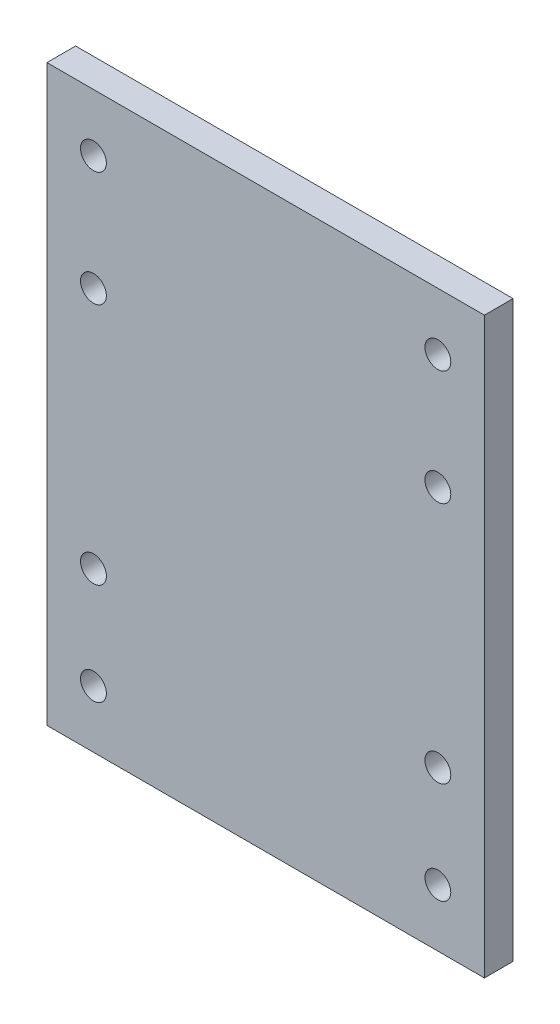
ISO-10303-21;
HEADER;
FILE_DESCRIPTION(('STEP AP214'),'2;1');
FILE_NAME('part.step','',(''),(''),'','','');
FILE_SCHEMA(('AUTOMOTIVE_DESIGN { 1 0 10303 214 1 1 1 1 }'));
ENDSEC;
DATA;
#1=APPLICATION_CONTEXT('core data for automotive mechanical design processes');
#2=APPLICATION_PROTOCOL_DEFINITION('international standard','automotive_design',2000,#1);
#3=PRODUCT_CONTEXT('',#1,'mechanical');
#4=PRODUCT('Part','Part','',(#3));
#5=PRODUCT_RELATED_PRODUCT_CATEGORY('part','',(#4));
#6=PRODUCT_DEFINITION_FORMATION('','',#4);
#7=PRODUCT_DEFINITION_CONTEXT('part definition',#1,'design');
#8=PRODUCT_DEFINITION('design','',#6,#7);
#9=PRODUCT_DEFINITION_SHAPE('','',#8);
#10=(LENGTH_UNIT() NAMED_UNIT(*) SI_UNIT(.MILLI.,.METRE.));
#11=(NAMED_UNIT(*) PLANE_ANGLE_UNIT() SI_UNIT($,.RADIAN.));
#12=(NAMED_UNIT(*) SI_UNIT($,.STERADIAN.) SOLID_ANGLE_UNIT());
#13=UNCERTAINTY_MEASURE_WITH_UNIT(LENGTH_MEASURE(1.E-05),#10,'distance_accuracy_value','');
#14=(GEOMETRIC_REPRESENTATION_CONTEXT(3) GLOBAL_UNCERTAINTY_ASSIGNED_CONTEXT((#13)) GLOBAL_UNIT_ASSIGNED_CONTEXT((#10,
#11,#12)) REPRESENTATION_CONTEXT('',''));
#15=CARTESIAN_POINT('',(0.,0.,0.));
#16=DIRECTION('',(0.,0.,1.));
#17=DIRECTION('',(1.,0.,0.));
#18=AXIS2_PLACEMENT_3D('',#15,#16,#17);
#19=CARTESIAN_POINT('',(-35.7444039436923,37.4815224030728,5.));
#20=DIRECTION('',(1.,0.,0.));
#21=DIRECTION('',(0.,1.,0.));
#22=AXIS2_PLACEMENT_3D('',#19,#20,#21);
#23=PLANE('',#22);
#24=DIRECTION('',(0.,-1.,0.));
#25=VECTOR('',#24,1.);
#26=CARTESIAN_POINT('',(-35.7444039436923,37.4815224030728,0.));
#27=LINE('',#26,#25);
#28=CARTESIAN_POINT('',(-35.7444039436923,37.4815224030728,0.));
#29=VERTEX_POINT('',#28);
#30=CARTESIAN_POINT('',(-35.7444039436923,-62.5184775969272,0.));
#31=VERTEX_POINT('',#30);
#32=EDGE_CURVE('E107',#29,#31,#27,.T.);
#33=ORIENTED_EDGE('',*,*,#32,.T.);
#34=DIRECTION('',(0.,0.,-1.));
#35=VECTOR('',#34,1.);
#36=CARTESIAN_POINT('',(-35.7444039436923,-62.5184775969272,5.));
#37=LINE('',#36,#35);
#38=CARTESIAN_POINT('',(-35.7444039436923,-62.5184775969272,5.));
#39=VERTEX_POINT('',#38);
#40=EDGE_CURVE('E11',#39,#31,#37,.T.);
#41=ORIENTED_EDGE('',*,*,#40,.F.);
#42=DIRECTION('',(0.,-1.,0.));
#43=VECTOR('',#42,1.);
#44=CARTESIAN_POINT('',(-35.7444039436923,37.4815224030728,5.));
#45=LINE('',#44,#43);
#46=CARTESIAN_POINT('',(-35.7444039436923,37.4815224030728,5.));
#47=VERTEX_POINT('',#46);
#48=EDGE_CURVE('E91',#47,#39,#45,.T.);
#49=ORIENTED_EDGE('',*,*,#48,.F.);
#50=DIRECTION('',(0.,0.,-1.));
#51=VECTOR('',#50,1.);
#52=CARTESIAN_POINT('',(-35.7444039436923,37.4815224030728,5.));
#53=LINE('',#52,#51);
#54=EDGE_CURVE('E103',#47,#29,#53,.T.);
#55=ORIENTED_EDGE('',*,*,#54,.T.);
#56=EDGE_LOOP('',(#33,#41,#49,#55));
#57=FACE_BOUND('',#56,.T.);
#58=ADVANCED_FACE('F39',(#57),#23,.F.);
#59=CARTESIAN_POINT('',(-35.7444039436923,-62.5184775969272,5.));
#60=DIRECTION('',(0.,1.,0.));
#61=DIRECTION('',(0.,0.,1.));
#62=AXIS2_PLACEMENT_3D('',#59,#60,#61);
#63=PLANE('',#62);
#64=DIRECTION('',(1.,0.,0.));
#65=VECTOR('',#64,1.);
#66=CARTESIAN_POINT('',(-35.7444039436923,-62.5184775969272,0.));
#67=LINE('',#66,#65);
#68=CARTESIAN_POINT('',(40.4655960563078,-62.5184775969272,0.));
#69=VERTEX_POINT('',#68);
#70=EDGE_CURVE('E96',#31,#69,#67,.T.);
#71=ORIENTED_EDGE('',*,*,#70,.T.);
#72=DIRECTION('',(0.,0.,-1.));
#73=VECTOR('',#72,1.);
#74=CARTESIAN_POINT('',(40.4655960563078,-62.5184775969272,5.));
#75=LINE('',#74,#73);
#76=CARTESIAN_POINT('',(40.4655960563078,-62.5184775969272,5.));
#77=VERTEX_POINT('',#76);
#78=EDGE_CURVE('E48',#77,#69,#75,.T.);
#79=ORIENTED_EDGE('',*,*,#78,.F.);
#80=DIRECTION('',(1.,0.,0.));
#81=VECTOR('',#80,1.);
#82=CARTESIAN_POINT('',(-35.7444039436923,-62.5184775969272,5.));
#83=LINE('',#82,#81);
#84=EDGE_CURVE('E86',#39,#77,#83,.T.);
#85=ORIENTED_EDGE('',*,*,#84,.F.);
#86=ORIENTED_EDGE('',*,*,#40,.T.);
#87=EDGE_LOOP('',(#71,#79,#85,#86));
#88=FACE_BOUND('',#87,.T.);
#89=ADVANCED_FACE('F95',(#88),#63,.F.);
#90=CARTESIAN_POINT('',(40.4655960563077,37.4815224030728,5.));
#91=DIRECTION('',(-1.,0.,0.));
#92=DIRECTION('',(0.,-1.,0.));
#93=AXIS2_PLACEMENT_3D('',#90,#91,#92);
#94=PLANE('',#93);
#95=DIRECTION('',(0.,1.,0.));
#96=VECTOR('',#95,1.);
#97=CARTESIAN_POINT('',(40.4655960563077,37.4815224030728,0.));
#98=LINE('',#97,#96);
#99=CARTESIAN_POINT('',(40.4655960563077,37.4815224030728,0.));
#100=VERTEX_POINT('',#99);
#101=EDGE_CURVE('E73',#69,#100,#98,.T.);
#102=ORIENTED_EDGE('',*,*,#101,.T.);
#103=DIRECTION('',(0.,0.,-1.));
#104=VECTOR('',#103,1.);
#105=CARTESIAN_POINT('',(40.4655960563077,37.4815224030728,5.));
#106=LINE('',#105,#104);
#107=CARTESIAN_POINT('',(40.4655960563077,37.4815224030728,5.));
#108=VERTEX_POINT('',#107);
#109=EDGE_CURVE('E98',#108,#100,#106,.T.);
#110=ORIENTED_EDGE('',*,*,#109,.F.);
#111=DIRECTION('',(0.,1.,0.));
#112=VECTOR('',#111,1.);
#113=CARTESIAN_POINT('',(40.4655960563077,37.4815224030728,5.));
#114=LINE('',#113,#112);
#115=EDGE_CURVE('E89',#77,#108,#114,.T.);
#116=ORIENTED_EDGE('',*,*,#115,.F.);
#117=ORIENTED_EDGE('',*,*,#78,.T.);
#118=EDGE_LOOP('',(#102,#110,#116,#117));
#119=FACE_BOUND('',#118,.T.);
#120=ADVANCED_FACE('F99',(#119),#94,.F.);
#121=CARTESIAN_POINT('',(-35.7444039436923,37.4815224030728,5.));
#122=DIRECTION('',(0.,-1.,0.));
#123=DIRECTION('',(0.,0.,-1.));
#124=AXIS2_PLACEMENT_3D('',#121,#122,#123);
#125=PLANE('',#124);
#126=DIRECTION('',(-1.,0.,0.));
#127=VECTOR('',#126,1.);
#128=CARTESIAN_POINT('',(-35.7444039436923,37.4815224030728,0.));
#129=LINE('',#128,#127);
#130=EDGE_CURVE('E79',#100,#29,#129,.T.);
#131=ORIENTED_EDGE('',*,*,#130,.T.);
#132=ORIENTED_EDGE('',*,*,#54,.F.);
#133=DIRECTION('',(-1.,0.,0.));
#134=VECTOR('',#133,1.);
#135=CARTESIAN_POINT('',(-35.7444039436923,37.4815224030728,5.));
#136=LINE('',#135,#134);
#137=EDGE_CURVE('E56',#108,#47,#136,.T.);
#138=ORIENTED_EDGE('',*,*,#137,.F.);
#139=ORIENTED_EDGE('',*,*,#109,.T.);
#140=EDGE_LOOP('',(#131,#132,#138,#139));
#141=FACE_BOUND('',#140,.T.);
#142=ADVANCED_FACE('F121',(#141),#125,.F.);
#143=CARTESIAN_POINT('',(0.,0.,5.));
#144=DIRECTION('',(0.,0.,1.));
#145=DIRECTION('',(1.,0.,0.));
#146=AXIS2_PLACEMENT_3D('',#143,#144,#145);
#147=PLANE('',#146);
#148=CARTESIAN_POINT('',(-27.6394039436923,7.48152240307282,5.));
#149=DIRECTION('',(0.,0.,1.));
#150=DIRECTION('',(1.,0.,0.));
#151=AXIS2_PLACEMENT_3D('',#148,#149,#150);
#152=CIRCLE('',#151,2.25);
#153=CARTESIAN_POINT('',(-25.3894039436923,7.48152240307282,5.));
#154=VERTEX_POINT('',#153);
#155=EDGE_CURVE('E187',#154,#154,#152,.T.);
#156=ORIENTED_EDGE('',*,*,#155,.F.);
#157=EDGE_LOOP('',(#156));
#158=FACE_BOUND('',#157,.T.);
#159=CARTESIAN_POINT('',(-27.6394039436923,27.4815224030728,5.));
#160=DIRECTION('',(0.,0.,1.));
#161=DIRECTION('',(1.,0.,0.));
#162=AXIS2_PLACEMENT_3D('',#159,#160,#161);
#163=CIRCLE('',#162,2.25);
#164=CARTESIAN_POINT('',(-25.3894039436923,27.4815224030728,5.));
#165=VERTEX_POINT('',#164);
#166=EDGE_CURVE('E179',#165,#165,#163,.T.);
#167=ORIENTED_EDGE('',*,*,#166,.F.);
#168=EDGE_LOOP('',(#167));
#169=FACE_BOUND('',#168,.T.);
#170=CARTESIAN_POINT('',(32.3605960563077,7.48152240307282,5.));
#171=DIRECTION('',(0.,0.,1.));
#172=DIRECTION('',(1.,0.,0.));
#173=AXIS2_PLACEMENT_3D('',#170,#171,#172);
#174=CIRCLE('',#173,2.25);
#175=CARTESIAN_POINT('',(34.6105960563077,7.48152240307282,5.));
#176=VERTEX_POINT('',#175);
#177=EDGE_CURVE('E171',#176,#176,#174,.T.);
#178=ORIENTED_EDGE('',*,*,#177,.F.);
#179=EDGE_LOOP('',(#178));
#180=FACE_BOUND('',#179,.T.);
#181=CARTESIAN_POINT('',(32.3605960563077,27.4815224030728,5.));
#182=DIRECTION('',(0.,0.,1.));
#183=DIRECTION('',(1.,0.,0.));
#184=AXIS2_PLACEMENT_3D('',#181,#182,#183);
#185=CIRCLE('',#184,2.25);
#186=CARTESIAN_POINT('',(34.6105960563077,27.4815224030728,5.));
#187=VERTEX_POINT('',#186);
#188=EDGE_CURVE('E163',#187,#187,#185,.T.);
#189=ORIENTED_EDGE('',*,*,#188,.F.);
#190=EDGE_LOOP('',(#189));
#191=FACE_BOUND('',#190,.T.);
#192=CARTESIAN_POINT('',(32.3605960563077,-52.5184775969272,5.));
#193=DIRECTION('',(0.,0.,1.));
#194=DIRECTION('',(1.,0.,0.));
#195=AXIS2_PLACEMENT_3D('',#192,#193,#194);
#196=CIRCLE('',#195,2.25);
#197=CARTESIAN_POINT('',(34.6105960563077,-52.5184775969272,5.));
#198=VERTEX_POINT('',#197);
#199=EDGE_CURVE('E155',#198,#198,#196,.T.);
#200=ORIENTED_EDGE('',*,*,#199,.F.);
#201=EDGE_LOOP('',(#200));
#202=FACE_BOUND('',#201,.T.);
#203=CARTESIAN_POINT('',(32.3605960563077,-34.818262244962,5.));
#204=DIRECTION('',(0.,0.,1.));
#205=DIRECTION('',(1.,0.,0.));
#206=AXIS2_PLACEMENT_3D('',#203,#204,#205);
#207=CIRCLE('',#206,2.25);
#208=CARTESIAN_POINT('',(34.6105960563077,-34.818262244962,5.));
#209=VERTEX_POINT('',#208);
#210=EDGE_CURVE('E147',#209,#209,#207,.T.);
#211=ORIENTED_EDGE('',*,*,#210,.F.);
#212=EDGE_LOOP('',(#211));
#213=FACE_BOUND('',#212,.T.);
#214=CARTESIAN_POINT('',(-27.6394039436923,-34.818262244962,5.));
#215=DIRECTION('',(0.,0.,1.));
#216=DIRECTION('',(1.,0.,0.));
#217=AXIS2_PLACEMENT_3D('',#214,#215,#216);
#218=CIRCLE('',#217,2.25);
#219=CARTESIAN_POINT('',(-25.3894039436923,-34.818262244962,5.));
#220=VERTEX_POINT('',#219);
#221=EDGE_CURVE('E139',#220,#220,#218,.T.);
#222=ORIENTED_EDGE('',*,*,#221,.F.);
#223=EDGE_LOOP('',(#222));
#224=FACE_BOUND('',#223,.T.);
#225=CARTESIAN_POINT('',(-27.6394039436923,-52.5184775969272,5.));
#226=DIRECTION('',(0.,0.,1.));
#227=DIRECTION('',(1.,0.,0.));
#228=AXIS2_PLACEMENT_3D('',#225,#226,#227);
#229=CIRCLE('',#228,2.25);
#230=CARTESIAN_POINT('',(-25.3894039436923,-52.5184775969272,5.));
#231=VERTEX_POINT('',#230);
#232=EDGE_CURVE('E131',#231,#231,#229,.T.);
#233=ORIENTED_EDGE('',*,*,#232,.F.);
#234=EDGE_LOOP('',(#233));
#235=FACE_BOUND('',#234,.T.);
#236=ORIENTED_EDGE('',*,*,#48,.T.);
#237=ORIENTED_EDGE('',*,*,#84,.T.);
#238=ORIENTED_EDGE('',*,*,#115,.T.);
#239=ORIENTED_EDGE('',*,*,#137,.T.);
#240=EDGE_LOOP('',(#236,#237,#238,#239));
#241=FACE_BOUND('',#240,.T.);
#242=ADVANCED_FACE('F87',(#158,#169,#180,#191,#202,#213,#224,#235,#241),#147,.T.);
#243=CARTESIAN_POINT('',(0.,0.,0.));
#244=DIRECTION('',(0.,0.,1.));
#245=DIRECTION('',(1.,0.,0.));
#246=AXIS2_PLACEMENT_3D('',#243,#244,#245);
#247=PLANE('',#246);
#248=CARTESIAN_POINT('',(-27.6394039436923,7.48152240307282,0.));
#249=DIRECTION('',(0.,0.,1.));
#250=DIRECTION('',(1.,0.,0.));
#251=AXIS2_PLACEMENT_3D('',#248,#249,#250);
#252=CIRCLE('',#251,2.25);
#253=CARTESIAN_POINT('',(-25.3894039436923,7.48152240307282,0.));
#254=VERTEX_POINT('',#253);
#255=EDGE_CURVE('E183',#254,#254,#252,.T.);
#256=ORIENTED_EDGE('',*,*,#255,.T.);
#257=EDGE_LOOP('',(#256));
#258=FACE_BOUND('',#257,.T.);
#259=CARTESIAN_POINT('',(-27.6394039436923,27.4815224030728,0.));
#260=DIRECTION('',(0.,0.,1.));
#261=DIRECTION('',(1.,0.,0.));
#262=AXIS2_PLACEMENT_3D('',#259,#260,#261);
#263=CIRCLE('',#262,2.25);
#264=CARTESIAN_POINT('',(-25.3894039436923,27.4815224030728,0.));
#265=VERTEX_POINT('',#264);
#266=EDGE_CURVE('E175',#265,#265,#263,.T.);
#267=ORIENTED_EDGE('',*,*,#266,.T.);
#268=EDGE_LOOP('',(#267));
#269=FACE_BOUND('',#268,.T.);
#270=CARTESIAN_POINT('',(32.3605960563077,7.48152240307282,0.));
#271=DIRECTION('',(0.,0.,1.));
#272=DIRECTION('',(1.,0.,0.));
#273=AXIS2_PLACEMENT_3D('',#270,#271,#272);
#274=CIRCLE('',#273,2.25);
#275=CARTESIAN_POINT('',(34.6105960563077,7.48152240307282,0.));
#276=VERTEX_POINT('',#275);
#277=EDGE_CURVE('E167',#276,#276,#274,.T.);
#278=ORIENTED_EDGE('',*,*,#277,.T.);
#279=EDGE_LOOP('',(#278));
#280=FACE_BOUND('',#279,.T.);
#281=CARTESIAN_POINT('',(32.3605960563077,27.4815224030728,0.));
#282=DIRECTION('',(0.,0.,1.));
#283=DIRECTION('',(1.,0.,0.));
#284=AXIS2_PLACEMENT_3D('',#281,#282,#283);
#285=CIRCLE('',#284,2.25);
#286=CARTESIAN_POINT('',(34.6105960563077,27.4815224030728,0.));
#287=VERTEX_POINT('',#286);
#288=EDGE_CURVE('E159',#287,#287,#285,.T.);
#289=ORIENTED_EDGE('',*,*,#288,.T.);
#290=EDGE_LOOP('',(#289));
#291=FACE_BOUND('',#290,.T.);
#292=CARTESIAN_POINT('',(32.3605960563077,-52.5184775969272,0.));
#293=DIRECTION('',(0.,0.,1.));
#294=DIRECTION('',(1.,0.,0.));
#295=AXIS2_PLACEMENT_3D('',#292,#293,#294);
#296=CIRCLE('',#295,2.25);
#297=CARTESIAN_POINT('',(34.6105960563077,-52.5184775969272,0.));
#298=VERTEX_POINT('',#297);
#299=EDGE_CURVE('E151',#298,#298,#296,.T.);
#300=ORIENTED_EDGE('',*,*,#299,.T.);
#301=EDGE_LOOP('',(#300));
#302=FACE_BOUND('',#301,.T.);
#303=CARTESIAN_POINT('',(32.3605960563077,-34.818262244962,0.));
#304=DIRECTION('',(0.,0.,1.));
#305=DIRECTION('',(1.,0.,0.));
#306=AXIS2_PLACEMENT_3D('',#303,#304,#305);
#307=CIRCLE('',#306,2.25);
#308=CARTESIAN_POINT('',(34.6105960563077,-34.818262244962,0.));
#309=VERTEX_POINT('',#308);
#310=EDGE_CURVE('E143',#309,#309,#307,.T.);
#311=ORIENTED_EDGE('',*,*,#310,.T.);
#312=EDGE_LOOP('',(#311));
#313=FACE_BOUND('',#312,.T.);
#314=CARTESIAN_POINT('',(-27.6394039436923,-34.818262244962,0.));
#315=DIRECTION('',(0.,0.,1.));
#316=DIRECTION('',(1.,0.,0.));
#317=AXIS2_PLACEMENT_3D('',#314,#315,#316);
#318=CIRCLE('',#317,2.25);
#319=CARTESIAN_POINT('',(-25.3894039436923,-34.818262244962,0.));
#320=VERTEX_POINT('',#319);
#321=EDGE_CURVE('E135',#320,#320,#318,.T.);
#322=ORIENTED_EDGE('',*,*,#321,.T.);
#323=EDGE_LOOP('',(#322));
#324=FACE_BOUND('',#323,.T.);
#325=CARTESIAN_POINT('',(-27.6394039436923,-52.5184775969272,0.));
#326=DIRECTION('',(0.,0.,1.));
#327=DIRECTION('',(1.,0.,0.));
#328=AXIS2_PLACEMENT_3D('',#325,#326,#327);
#329=CIRCLE('',#328,2.25);
#330=CARTESIAN_POINT('',(-25.3894039436923,-52.5184775969272,0.));
#331=VERTEX_POINT('',#330);
#332=EDGE_CURVE('E111',#331,#331,#329,.T.);
#333=ORIENTED_EDGE('',*,*,#332,.T.);
#334=EDGE_LOOP('',(#333));
#335=FACE_BOUND('',#334,.T.);
#336=ORIENTED_EDGE('',*,*,#32,.F.);
#337=ORIENTED_EDGE('',*,*,#130,.F.);
#338=ORIENTED_EDGE('',*,*,#101,.F.);
#339=ORIENTED_EDGE('',*,*,#70,.F.);
#340=EDGE_LOOP('',(#336,#337,#338,#339));
#341=FACE_BOUND('',#340,.T.);
#342=ADVANCED_FACE('F124',(#258,#269,#280,#291,#302,#313,#324,#335,#341),#247,.F.);
#343=CARTESIAN_POINT('',(-27.6394039436923,-52.5184775969272,5.));
#344=DIRECTION('',(0.,0.,1.));
#345=DIRECTION('',(1.,0.,0.));
#346=AXIS2_PLACEMENT_3D('',#343,#344,#345);
#347=CYLINDRICAL_SURFACE('',#346,2.25);
#348=ORIENTED_EDGE('',*,*,#332,.F.);
#349=EDGE_LOOP('',(#348));
#350=FACE_BOUND('',#349,.T.);
#351=ORIENTED_EDGE('',*,*,#232,.T.);
#352=EDGE_LOOP('',(#351));
#353=FACE_BOUND('',#352,.T.);
#354=ADVANCED_FACE('F211',(#350,#353),#347,.F.);
#355=CARTESIAN_POINT('',(-27.6394039436923,-34.818262244962,5.));
#356=DIRECTION('',(0.,0.,1.));
#357=DIRECTION('',(1.,0.,0.));
#358=AXIS2_PLACEMENT_3D('',#355,#356,#357);
#359=CYLINDRICAL_SURFACE('',#358,2.25);
#360=ORIENTED_EDGE('',*,*,#321,.F.);
#361=EDGE_LOOP('',(#360));
#362=FACE_BOUND('',#361,.T.);
#363=ORIENTED_EDGE('',*,*,#221,.T.);
#364=EDGE_LOOP('',(#363));
#365=FACE_BOUND('',#364,.T.);
#366=ADVANCED_FACE('F213',(#362,#365),#359,.F.);
#367=CARTESIAN_POINT('',(32.3605960563077,-34.818262244962,5.));
#368=DIRECTION('',(0.,0.,1.));
#369=DIRECTION('',(1.,0.,0.));
#370=AXIS2_PLACEMENT_3D('',#367,#368,#369);
#371=CYLINDRICAL_SURFACE('',#370,2.25);
#372=ORIENTED_EDGE('',*,*,#310,.F.);
#373=EDGE_LOOP('',(#372));
#374=FACE_BOUND('',#373,.T.);
#375=ORIENTED_EDGE('',*,*,#210,.T.);
#376=EDGE_LOOP('',(#375));
#377=FACE_BOUND('',#376,.T.);
#378=ADVANCED_FACE('F220',(#374,#377),#371,.F.);
#379=CARTESIAN_POINT('',(32.3605960563077,-52.5184775969272,5.));
#380=DIRECTION('',(0.,0.,1.));
#381=DIRECTION('',(1.,0.,0.));
#382=AXIS2_PLACEMENT_3D('',#379,#380,#381);
#383=CYLINDRICAL_SURFACE('',#382,2.25);
#384=ORIENTED_EDGE('',*,*,#299,.F.);
#385=EDGE_LOOP('',(#384));
#386=FACE_BOUND('',#385,.T.);
#387=ORIENTED_EDGE('',*,*,#199,.T.);
#388=EDGE_LOOP('',(#387));
#389=FACE_BOUND('',#388,.T.);
#390=ADVANCED_FACE('F267',(#386,#389),#383,.F.);
#391=CARTESIAN_POINT('',(32.3605960563077,27.4815224030728,5.));
#392=DIRECTION('',(0.,0.,1.));
#393=DIRECTION('',(1.,0.,0.));
#394=AXIS2_PLACEMENT_3D('',#391,#392,#393);
#395=CYLINDRICAL_SURFACE('',#394,2.25);
#396=ORIENTED_EDGE('',*,*,#288,.F.);
#397=EDGE_LOOP('',(#396));
#398=FACE_BOUND('',#397,.T.);
#399=ORIENTED_EDGE('',*,*,#188,.T.);
#400=EDGE_LOOP('',(#399));
#401=FACE_BOUND('',#400,.T.);
#402=ADVANCED_FACE('F277',(#398,#401),#395,.F.);
#403=CARTESIAN_POINT('',(32.3605960563077,7.48152240307282,5.));
#404=DIRECTION('',(0.,0.,1.));
#405=DIRECTION('',(1.,0.,0.));
#406=AXIS2_PLACEMENT_3D('',#403,#404,#405);
#407=CYLINDRICAL_SURFACE('',#406,2.25);
#408=ORIENTED_EDGE('',*,*,#277,.F.);
#409=EDGE_LOOP('',(#408));
#410=FACE_BOUND('',#409,.T.);
#411=ORIENTED_EDGE('',*,*,#177,.T.);
#412=EDGE_LOOP('',(#411));
#413=FACE_BOUND('',#412,.T.);
#414=ADVANCED_FACE('F287',(#410,#413),#407,.F.);
#415=CARTESIAN_POINT('',(-27.6394039436923,27.4815224030728,5.));
#416=DIRECTION('',(0.,0.,1.));
#417=DIRECTION('',(1.,0.,0.));
#418=AXIS2_PLACEMENT_3D('',#415,#416,#417);
#419=CYLINDRICAL_SURFACE('',#418,2.25);
#420=ORIENTED_EDGE('',*,*,#266,.F.);
#421=EDGE_LOOP('',(#420));
#422=FACE_BOUND('',#421,.T.);
#423=ORIENTED_EDGE('',*,*,#166,.T.);
#424=EDGE_LOOP('',(#423));
#425=FACE_BOUND('',#424,.T.);
#426=ADVANCED_FACE('F297',(#422,#425),#419,.F.);
#427=CARTESIAN_POINT('',(-27.6394039436923,7.48152240307282,5.));
#428=DIRECTION('',(0.,0.,1.));
#429=DIRECTION('',(1.,0.,0.));
#430=AXIS2_PLACEMENT_3D('',#427,#428,#429);
#431=CYLINDRICAL_SURFACE('',#430,2.25);
#432=ORIENTED_EDGE('',*,*,#255,.F.);
#433=EDGE_LOOP('',(#432));
#434=FACE_BOUND('',#433,.T.);
#435=ORIENTED_EDGE('',*,*,#155,.T.);
#436=EDGE_LOOP('',(#435));
#437=FACE_BOUND('',#436,.T.);
#438=ADVANCED_FACE('F192',(#434,#437),#431,.F.);
#439=CLOSED_SHELL('',(#58,#89,#120,#142,#242,#342,#354,#366,#378,#390,#402,#414,#426,#438));
#440=MANIFOLD_SOLID_BREP('B2',#439);
#441=ADVANCED_BREP_SHAPE_REPRESENTATION('',(#18,#440),#14);
#442=SHAPE_DEFINITION_REPRESENTATION(#9,#441);
ENDSEC;
END-ISO-10303-21;
